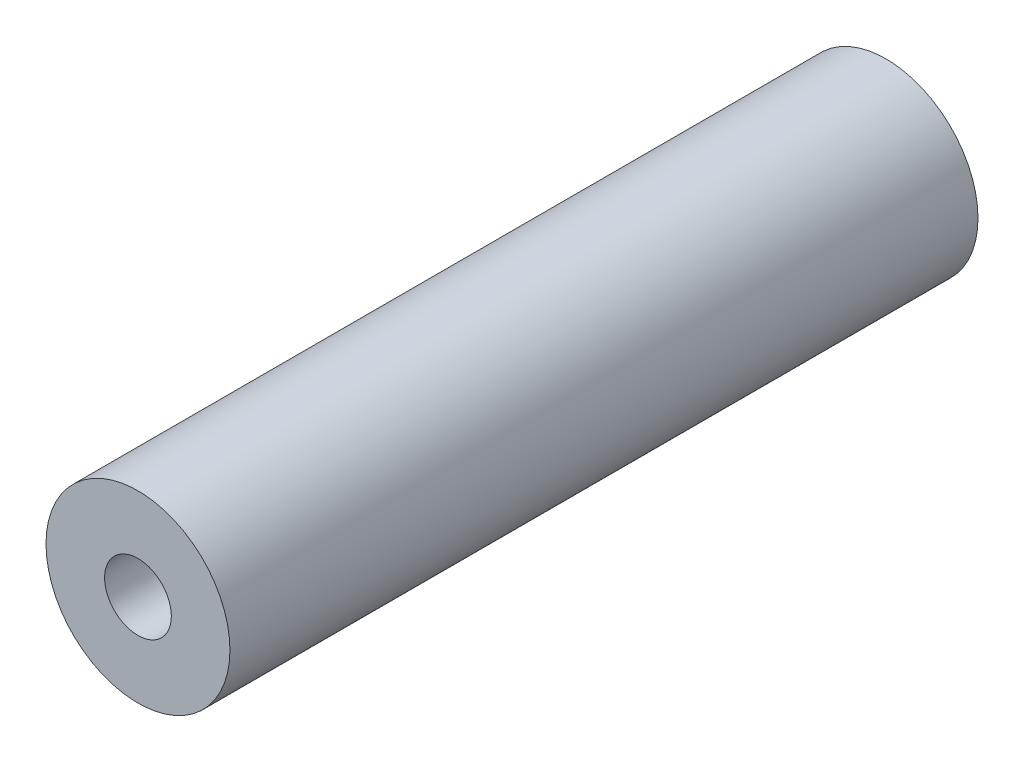
ISO-10303-21;
HEADER;
FILE_DESCRIPTION(('STEP AP214'),'2;1');
FILE_NAME('part.step','',(''),(''),'','','');
FILE_SCHEMA(('AUTOMOTIVE_DESIGN { 1 0 10303 214 1 1 1 1 }'));
ENDSEC;
DATA;
#1=APPLICATION_CONTEXT('core data for automotive mechanical design processes');
#2=APPLICATION_PROTOCOL_DEFINITION('international standard','automotive_design',2000,#1);
#3=PRODUCT_CONTEXT('',#1,'mechanical');
#4=PRODUCT('Part','Part','',(#3));
#5=PRODUCT_RELATED_PRODUCT_CATEGORY('part','',(#4));
#6=PRODUCT_DEFINITION_FORMATION('','',#4);
#7=PRODUCT_DEFINITION_CONTEXT('part definition',#1,'design');
#8=PRODUCT_DEFINITION('design','',#6,#7);
#9=PRODUCT_DEFINITION_SHAPE('','',#8);
#10=(LENGTH_UNIT() NAMED_UNIT(*) SI_UNIT(.MILLI.,.METRE.));
#11=(NAMED_UNIT(*) PLANE_ANGLE_UNIT() SI_UNIT($,.RADIAN.));
#12=(NAMED_UNIT(*) SI_UNIT($,.STERADIAN.) SOLID_ANGLE_UNIT());
#13=UNCERTAINTY_MEASURE_WITH_UNIT(LENGTH_MEASURE(1.E-05),#10,'distance_accuracy_value','');
#14=(GEOMETRIC_REPRESENTATION_CONTEXT(3) GLOBAL_UNCERTAINTY_ASSIGNED_CONTEXT((#13)) GLOBAL_UNIT_ASSIGNED_CONTEXT((#10,
#11,#12)) REPRESENTATION_CONTEXT('',''));
#15=CARTESIAN_POINT('',(0.,0.,0.));
#16=DIRECTION('',(0.,0.,1.));
#17=DIRECTION('',(1.,0.,0.));
#18=AXIS2_PLACEMENT_3D('',#15,#16,#17);
#19=CARTESIAN_POINT('',(0.,0.,0.));
#20=DIRECTION('',(0.,0.,1.));
#21=DIRECTION('',(1.,0.,0.));
#22=AXIS2_PLACEMENT_3D('',#19,#20,#21);
#23=PLANE('',#22);
#24=CARTESIAN_POINT('',(0.,0.,0.));
#25=DIRECTION('',(0.,0.,1.));
#26=DIRECTION('',(1.,0.,0.));
#27=AXIS2_PLACEMENT_3D('',#24,#25,#26);
#28=CIRCLE('',#27,1.72719999999999);
#29=CARTESIAN_POINT('',(1.72719999999999,0.,0.));
#30=VERTEX_POINT('',#29);
#31=EDGE_CURVE('E75',#30,#30,#28,.T.);
#32=ORIENTED_EDGE('',*,*,#31,.F.);
#33=EDGE_LOOP('',(#32));
#34=FACE_BOUND('',#33,.T.);
#35=CARTESIAN_POINT('',(0.,0.,0.));
#36=DIRECTION('',(0.,0.,-1.));
#37=DIRECTION('',(-1.,0.,0.));
#38=AXIS2_PLACEMENT_3D('',#35,#36,#37);
#39=CIRCLE('',#38,4.7625);
#40=CARTESIAN_POINT('',(-4.7625,0.,0.));
#41=VERTEX_POINT('',#40);
#42=EDGE_CURVE('E13',#41,#41,#39,.T.);
#43=ORIENTED_EDGE('',*,*,#42,.F.);
#44=EDGE_LOOP('',(#43));
#45=FACE_BOUND('',#44,.T.);
#46=ADVANCED_FACE('F52',(#34,#45),#23,.T.);
#47=CARTESIAN_POINT('',(0.,0.,0.));
#48=DIRECTION('',(0.,0.,-1.));
#49=DIRECTION('',(-1.,0.,0.));
#50=AXIS2_PLACEMENT_3D('',#47,#48,#49);
#51=CYLINDRICAL_SURFACE('',#50,4.7625);
#52=ORIENTED_EDGE('',*,*,#42,.T.);
#53=EDGE_LOOP('',(#52));
#54=FACE_BOUND('',#53,.T.);
#55=CARTESIAN_POINT('',(0.,0.,-38.735));
#56=DIRECTION('',(0.,0.,-1.));
#57=DIRECTION('',(-1.,0.,0.));
#58=AXIS2_PLACEMENT_3D('',#55,#56,#57);
#59=CIRCLE('',#58,4.7625);
#60=CARTESIAN_POINT('',(-4.7625,0.,-38.735));
#61=VERTEX_POINT('',#60);
#62=EDGE_CURVE('E59',#61,#61,#59,.T.);
#63=ORIENTED_EDGE('',*,*,#62,.F.);
#64=EDGE_LOOP('',(#63));
#65=FACE_BOUND('',#64,.T.);
#66=ADVANCED_FACE('F90',(#54,#65),#51,.T.);
#67=CARTESIAN_POINT('',(0.,0.,-38.735));
#68=DIRECTION('',(0.,0.,-1.));
#69=DIRECTION('',(-1.,0.,0.));
#70=AXIS2_PLACEMENT_3D('',#67,#68,#69);
#71=PLANE('',#70);
#72=CARTESIAN_POINT('',(0.,0.,-38.735));
#73=DIRECTION('',(0.,0.,-1.));
#74=DIRECTION('',(-1.,0.,0.));
#75=AXIS2_PLACEMENT_3D('',#72,#73,#74);
#76=CIRCLE('',#75,1.72719999999999);
#77=CARTESIAN_POINT('',(-1.72719999999999,0.,-38.735));
#78=VERTEX_POINT('',#77);
#79=EDGE_CURVE('E76',#78,#78,#76,.T.);
#80=ORIENTED_EDGE('',*,*,#79,.F.);
#81=EDGE_LOOP('',(#80));
#82=FACE_BOUND('',#81,.T.);
#83=ORIENTED_EDGE('',*,*,#62,.T.);
#84=EDGE_LOOP('',(#83));
#85=FACE_BOUND('',#84,.T.);
#86=ADVANCED_FACE('F88',(#82,#85),#71,.T.);
#87=CARTESIAN_POINT('',(0.,0.,-10.7188));
#88=DIRECTION('',(0.,0.,1.));
#89=DIRECTION('',(1.,0.,0.));
#90=AXIS2_PLACEMENT_3D('',#87,#88,#89);
#91=CONICAL_SURFACE('',#90,1.7272,1.02974425867665);
#92=CARTESIAN_POINT('',(0.,0.,-11.7566064611844));
#93=VERTEX_POINT('',#92);
#94=VERTEX_LOOP('',#93);
#95=FACE_BOUND('',#94,.T.);
#96=CARTESIAN_POINT('',(0.,0.,-10.7188));
#97=DIRECTION('',(0.,0.,1.));
#98=DIRECTION('',(1.,0.,0.));
#99=AXIS2_PLACEMENT_3D('',#96,#97,#98);
#100=CIRCLE('',#99,1.7272);
#101=CARTESIAN_POINT('',(1.7272,0.,-10.7188));
#102=VERTEX_POINT('',#101);
#103=EDGE_CURVE('E79',#102,#102,#100,.T.);
#104=ORIENTED_EDGE('',*,*,#103,.T.);
#105=EDGE_LOOP('',(#104));
#106=FACE_BOUND('',#105,.T.);
#107=ADVANCED_FACE('F97',(#95,#106),#91,.F.);
#108=CARTESIAN_POINT('',(0.,0.,0.));
#109=DIRECTION('',(0.,0.,1.));
#110=DIRECTION('',(1.,0.,0.));
#111=AXIS2_PLACEMENT_3D('',#108,#109,#110);
#112=CYLINDRICAL_SURFACE('',#111,1.72719999999999);
#113=ORIENTED_EDGE('',*,*,#103,.F.);
#114=EDGE_LOOP('',(#113));
#115=FACE_BOUND('',#114,.T.);
#116=ORIENTED_EDGE('',*,*,#31,.T.);
#117=EDGE_LOOP('',(#116));
#118=FACE_BOUND('',#117,.T.);
#119=ADVANCED_FACE('F69',(#115,#118),#112,.F.);
#120=CARTESIAN_POINT('',(0.,0.,-28.0162));
#121=DIRECTION('',(0.,0.,-1.));
#122=DIRECTION('',(-1.,0.,0.));
#123=AXIS2_PLACEMENT_3D('',#120,#121,#122);
#124=CONICAL_SURFACE('',#123,1.72719999999999,1.02974425867665);
#125=CARTESIAN_POINT('',(0.,0.,-26.9783935388156));
#126=VERTEX_POINT('',#125);
#127=VERTEX_LOOP('',#126);
#128=FACE_BOUND('',#127,.T.);
#129=CARTESIAN_POINT('',(0.,0.,-28.0162));
#130=DIRECTION('',(0.,0.,-1.));
#131=DIRECTION('',(-1.,0.,0.));
#132=AXIS2_PLACEMENT_3D('',#129,#130,#131);
#133=CIRCLE('',#132,1.72719999999999);
#134=CARTESIAN_POINT('',(-1.72719999999999,0.,-28.0162));
#135=VERTEX_POINT('',#134);
#136=EDGE_CURVE('E73',#135,#135,#133,.T.);
#137=ORIENTED_EDGE('',*,*,#136,.T.);
#138=EDGE_LOOP('',(#137));
#139=FACE_BOUND('',#138,.T.);
#140=ADVANCED_FACE('F65',(#128,#139),#124,.F.);
#141=CARTESIAN_POINT('',(0.,0.,-38.735));
#142=DIRECTION('',(0.,0.,-1.));
#143=DIRECTION('',(-1.,0.,0.));
#144=AXIS2_PLACEMENT_3D('',#141,#142,#143);
#145=CYLINDRICAL_SURFACE('',#144,1.72719999999999);
#146=ORIENTED_EDGE('',*,*,#136,.F.);
#147=EDGE_LOOP('',(#146));
#148=FACE_BOUND('',#147,.T.);
#149=ORIENTED_EDGE('',*,*,#79,.T.);
#150=EDGE_LOOP('',(#149));
#151=FACE_BOUND('',#150,.T.);
#152=ADVANCED_FACE('F68',(#148,#151),#145,.F.);
#153=CLOSED_SHELL('',(#46,#66,#86,#107,#119,#140,#152));
#154=MANIFOLD_SOLID_BREP('B2',#153);
#155=ADVANCED_BREP_SHAPE_REPRESENTATION('',(#18,#154),#14);
#156=SHAPE_DEFINITION_REPRESENTATION(#9,#155);
ENDSEC;
END-ISO-10303-21;
